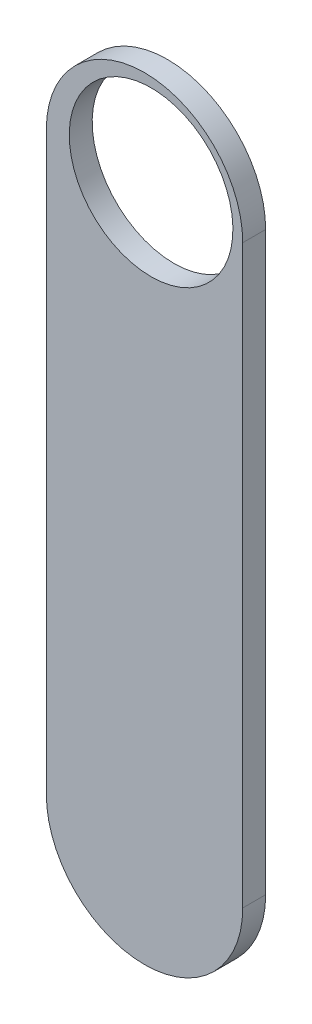
ISO-10303-21;
HEADER;
FILE_DESCRIPTION(('STEP AP214'),'2;1');
FILE_NAME('part.step','',(''),(''),'','','');
FILE_SCHEMA(('AUTOMOTIVE_DESIGN { 1 0 10303 214 1 1 1 1 }'));
ENDSEC;
DATA;
#1=APPLICATION_CONTEXT('core data for automotive mechanical design processes');
#2=APPLICATION_PROTOCOL_DEFINITION('international standard','automotive_design',2000,#1);
#3=PRODUCT_CONTEXT('',#1,'mechanical');
#4=PRODUCT('Part','Part','',(#3));
#5=PRODUCT_RELATED_PRODUCT_CATEGORY('part','',(#4));
#6=PRODUCT_DEFINITION_FORMATION('','',#4);
#7=PRODUCT_DEFINITION_CONTEXT('part definition',#1,'design');
#8=PRODUCT_DEFINITION('design','',#6,#7);
#9=PRODUCT_DEFINITION_SHAPE('','',#8);
#10=(LENGTH_UNIT() NAMED_UNIT(*) SI_UNIT(.MILLI.,.METRE.));
#11=(NAMED_UNIT(*) PLANE_ANGLE_UNIT() SI_UNIT($,.RADIAN.));
#12=(NAMED_UNIT(*) SI_UNIT($,.STERADIAN.) SOLID_ANGLE_UNIT());
#13=UNCERTAINTY_MEASURE_WITH_UNIT(LENGTH_MEASURE(1.E-05),#10,'distance_accuracy_value','');
#14=(GEOMETRIC_REPRESENTATION_CONTEXT(3) GLOBAL_UNCERTAINTY_ASSIGNED_CONTEXT((#13)) GLOBAL_UNIT_ASSIGNED_CONTEXT((#10,
#11,#12)) REPRESENTATION_CONTEXT('',''));
#15=CARTESIAN_POINT('',(0.,0.,0.));
#16=DIRECTION('',(0.,0.,1.));
#17=DIRECTION('',(1.,0.,0.));
#18=AXIS2_PLACEMENT_3D('',#15,#16,#17);
#19=CARTESIAN_POINT('',(119.44,-62.63,-0.045));
#20=DIRECTION('',(0.,0.,-1.));
#21=DIRECTION('',(0.,-1.,0.));
#22=AXIS2_PLACEMENT_3D('',#19,#20,#21);
#23=CYLINDRICAL_SURFACE('',#22,0.125);
#24=CARTESIAN_POINT('',(119.44,-62.63,1.6));
#25=DIRECTION('',(0.,0.,-1.));
#26=DIRECTION('',(0.,-1.,0.));
#27=AXIS2_PLACEMENT_3D('',#24,#25,#26);
#28=CIRCLE('',#27,0.125);
#29=CARTESIAN_POINT('',(119.44,-62.755,1.6));
#30=VERTEX_POINT('',#29);
#31=EDGE_CURVE('E124',#30,#30,#28,.T.);
#32=ORIENTED_EDGE('',*,*,#31,.T.);
#33=DIRECTION('',(0.,0.,1.));
#34=VECTOR('',#33,1.);
#35=CARTESIAN_POINT('',(119.44,-62.755,-0.045));
#36=LINE('',#35,#34);
#37=CARTESIAN_POINT('',(119.44,-62.755,1.635));
#38=VERTEX_POINT('',#37);
#39=EDGE_CURVE('E11',#30,#38,#36,.T.);
#40=ORIENTED_EDGE('',*,*,#39,.T.);
#41=CARTESIAN_POINT('',(119.44,-62.63,1.635));
#42=DIRECTION('',(0.,0.,-1.));
#43=DIRECTION('',(0.,-1.,0.));
#44=AXIS2_PLACEMENT_3D('',#41,#42,#43);
#45=CIRCLE('',#44,0.125);
#46=EDGE_CURVE('E28',#38,#38,#45,.T.);
#47=ORIENTED_EDGE('',*,*,#46,.F.);
#48=ORIENTED_EDGE('',*,*,#39,.F.);
#49=EDGE_LOOP('',(#32,#40,#47,#48));
#50=FACE_BOUND('',#49,.T.);
#51=ADVANCED_FACE('F17',(#50),#23,.F.);
#52=CARTESIAN_POINT('',(119.28,-62.64,1.6));
#53=DIRECTION('',(1.,0.,0.));
#54=DIRECTION('',(0.,1.,0.));
#55=AXIS2_PLACEMENT_3D('',#52,#53,#54);
#56=PLANE('',#55);
#57=DIRECTION('',(0.,-1.,0.));
#58=VECTOR('',#57,1.);
#59=CARTESIAN_POINT('',(119.28,-62.64,1.6));
#60=LINE('',#59,#58);
#61=CARTESIAN_POINT('',(119.28,-62.64,1.6));
#62=VERTEX_POINT('',#61);
#63=CARTESIAN_POINT('',(119.28,-63.52,1.6));
#64=VERTEX_POINT('',#63);
#65=EDGE_CURVE('E21',#62,#64,#60,.T.);
#66=ORIENTED_EDGE('',*,*,#65,.T.);
#67=DIRECTION('',(0.,0.,1.));
#68=VECTOR('',#67,1.);
#69=CARTESIAN_POINT('',(119.28,-63.52,1.6));
#70=LINE('',#69,#68);
#71=CARTESIAN_POINT('',(119.28,-63.52,1.635));
#72=VERTEX_POINT('',#71);
#73=EDGE_CURVE('E96',#64,#72,#70,.T.);
#74=ORIENTED_EDGE('',*,*,#73,.T.);
#75=DIRECTION('',(0.,-1.,0.));
#76=VECTOR('',#75,1.);
#77=CARTESIAN_POINT('',(119.28,-62.64,1.635));
#78=LINE('',#77,#76);
#79=CARTESIAN_POINT('',(119.28,-62.64,1.635));
#80=VERTEX_POINT('',#79);
#81=EDGE_CURVE('E122',#80,#72,#78,.T.);
#82=ORIENTED_EDGE('',*,*,#81,.F.);
#83=DIRECTION('',(0.,0.,1.));
#84=VECTOR('',#83,1.);
#85=CARTESIAN_POINT('',(119.28,-62.64,1.6));
#86=LINE('',#85,#84);
#87=EDGE_CURVE('E130',#62,#80,#86,.T.);
#88=ORIENTED_EDGE('',*,*,#87,.F.);
#89=EDGE_LOOP('',(#66,#74,#82,#88));
#90=FACE_BOUND('',#89,.T.);
#91=ADVANCED_FACE('F19',(#90),#56,.F.);
#92=CARTESIAN_POINT('',(119.58,-63.52,1.635));
#93=DIRECTION('',(0.,0.,1.));
#94=DIRECTION('',(1.,0.,0.));
#95=AXIS2_PLACEMENT_3D('',#92,#93,#94);
#96=PLANE('',#95);
#97=ORIENTED_EDGE('',*,*,#46,.T.);
#98=EDGE_LOOP('',(#97));
#99=FACE_BOUND('',#98,.T.);
#100=DIRECTION('',(0.,1.,0.));
#101=VECTOR('',#100,1.);
#102=CARTESIAN_POINT('',(119.58,-63.52,1.635));
#103=LINE('',#102,#101);
#104=CARTESIAN_POINT('',(119.58,-63.52,1.635));
#105=VERTEX_POINT('',#104);
#106=CARTESIAN_POINT('',(119.58,-62.64,1.635));
#107=VERTEX_POINT('',#106);
#108=EDGE_CURVE('E106',#105,#107,#103,.T.);
#109=ORIENTED_EDGE('',*,*,#108,.T.);
#110=CARTESIAN_POINT('',(119.43,-62.64,1.635));
#111=DIRECTION('',(0.,0.,1.));
#112=DIRECTION('',(1.,0.,0.));
#113=AXIS2_PLACEMENT_3D('',#110,#111,#112);
#114=CIRCLE('',#113,0.15);
#115=EDGE_CURVE('E80',#107,#80,#114,.T.);
#116=ORIENTED_EDGE('',*,*,#115,.T.);
#117=ORIENTED_EDGE('',*,*,#81,.T.);
#118=CARTESIAN_POINT('',(119.43,-63.52,1.635));
#119=DIRECTION('',(0.,0.,1.));
#120=DIRECTION('',(-1.,0.,0.));
#121=AXIS2_PLACEMENT_3D('',#118,#119,#120);
#122=CIRCLE('',#121,0.15);
#123=EDGE_CURVE('E70',#72,#105,#122,.T.);
#124=ORIENTED_EDGE('',*,*,#123,.T.);
#125=EDGE_LOOP('',(#109,#116,#117,#124));
#126=FACE_BOUND('',#125,.T.);
#127=ADVANCED_FACE('F197',(#99,#126),#96,.T.);
#128=CARTESIAN_POINT('',(119.58,-63.52,1.6));
#129=DIRECTION('',(0.,0.,1.));
#130=DIRECTION('',(1.,0.,0.));
#131=AXIS2_PLACEMENT_3D('',#128,#129,#130);
#132=PLANE('',#131);
#133=ORIENTED_EDGE('',*,*,#31,.F.);
#134=EDGE_LOOP('',(#133));
#135=FACE_BOUND('',#134,.T.);
#136=CARTESIAN_POINT('',(119.43,-63.52,1.6));
#137=DIRECTION('',(0.,0.,1.));
#138=DIRECTION('',(-1.,0.,0.));
#139=AXIS2_PLACEMENT_3D('',#136,#137,#138);
#140=CIRCLE('',#139,0.15);
#141=CARTESIAN_POINT('',(119.58,-63.52,1.6));
#142=VERTEX_POINT('',#141);
#143=EDGE_CURVE('E91',#64,#142,#140,.T.);
#144=ORIENTED_EDGE('',*,*,#143,.F.);
#145=ORIENTED_EDGE('',*,*,#65,.F.);
#146=CARTESIAN_POINT('',(119.43,-62.64,1.6));
#147=DIRECTION('',(0.,0.,1.));
#148=DIRECTION('',(1.,0.,0.));
#149=AXIS2_PLACEMENT_3D('',#146,#147,#148);
#150=CIRCLE('',#149,0.15);
#151=CARTESIAN_POINT('',(119.58,-62.64,1.6));
#152=VERTEX_POINT('',#151);
#153=EDGE_CURVE('E111',#152,#62,#150,.T.);
#154=ORIENTED_EDGE('',*,*,#153,.F.);
#155=DIRECTION('',(0.,1.,0.));
#156=VECTOR('',#155,1.);
#157=CARTESIAN_POINT('',(119.58,-63.52,1.6));
#158=LINE('',#157,#156);
#159=EDGE_CURVE('E105',#142,#152,#158,.T.);
#160=ORIENTED_EDGE('',*,*,#159,.F.);
#161=EDGE_LOOP('',(#144,#145,#154,#160));
#162=FACE_BOUND('',#161,.T.);
#163=ADVANCED_FACE('F109',(#135,#162),#132,.F.);
#164=CARTESIAN_POINT('',(119.43,-62.64,1.6));
#165=DIRECTION('',(0.,0.,-1.));
#166=DIRECTION('',(1.,0.,0.));
#167=AXIS2_PLACEMENT_3D('',#164,#165,#166);
#168=CYLINDRICAL_SURFACE('',#167,0.15);
#169=ORIENTED_EDGE('',*,*,#153,.T.);
#170=ORIENTED_EDGE('',*,*,#87,.T.);
#171=ORIENTED_EDGE('',*,*,#115,.F.);
#172=DIRECTION('',(0.,0.,1.));
#173=VECTOR('',#172,1.);
#174=CARTESIAN_POINT('',(119.58,-62.64,1.6));
#175=LINE('',#174,#173);
#176=EDGE_CURVE('E113',#152,#107,#175,.T.);
#177=ORIENTED_EDGE('',*,*,#176,.F.);
#178=EDGE_LOOP('',(#169,#170,#171,#177));
#179=FACE_BOUND('',#178,.T.);
#180=ADVANCED_FACE('F180',(#179),#168,.T.);
#181=CARTESIAN_POINT('',(119.43,-63.52,1.6));
#182=DIRECTION('',(0.,0.,-1.));
#183=DIRECTION('',(-1.,0.,0.));
#184=AXIS2_PLACEMENT_3D('',#181,#182,#183);
#185=CYLINDRICAL_SURFACE('',#184,0.15);
#186=ORIENTED_EDGE('',*,*,#143,.T.);
#187=DIRECTION('',(0.,0.,1.));
#188=VECTOR('',#187,1.);
#189=CARTESIAN_POINT('',(119.58,-63.52,1.6));
#190=LINE('',#189,#188);
#191=EDGE_CURVE('E94',#142,#105,#190,.T.);
#192=ORIENTED_EDGE('',*,*,#191,.T.);
#193=ORIENTED_EDGE('',*,*,#123,.F.);
#194=ORIENTED_EDGE('',*,*,#73,.F.);
#195=EDGE_LOOP('',(#186,#192,#193,#194));
#196=FACE_BOUND('',#195,.T.);
#197=ADVANCED_FACE('F93',(#196),#185,.T.);
#198=CARTESIAN_POINT('',(119.58,-63.52,1.6));
#199=DIRECTION('',(-1.,0.,0.));
#200=DIRECTION('',(0.,0.,1.));
#201=AXIS2_PLACEMENT_3D('',#198,#199,#200);
#202=PLANE('',#201);
#203=ORIENTED_EDGE('',*,*,#159,.T.);
#204=ORIENTED_EDGE('',*,*,#176,.T.);
#205=ORIENTED_EDGE('',*,*,#108,.F.);
#206=ORIENTED_EDGE('',*,*,#191,.F.);
#207=EDGE_LOOP('',(#203,#204,#205,#206));
#208=FACE_BOUND('',#207,.T.);
#209=ADVANCED_FACE('F103',(#208),#202,.F.);
#210=CLOSED_SHELL('',(#51,#91,#127,#163,#180,#197,#209));
#211=MANIFOLD_SOLID_BREP('B1',#210);
#212=ADVANCED_BREP_SHAPE_REPRESENTATION('',(#18,#211),#14);
#213=SHAPE_DEFINITION_REPRESENTATION(#9,#212);
ENDSEC;
END-ISO-10303-21;
